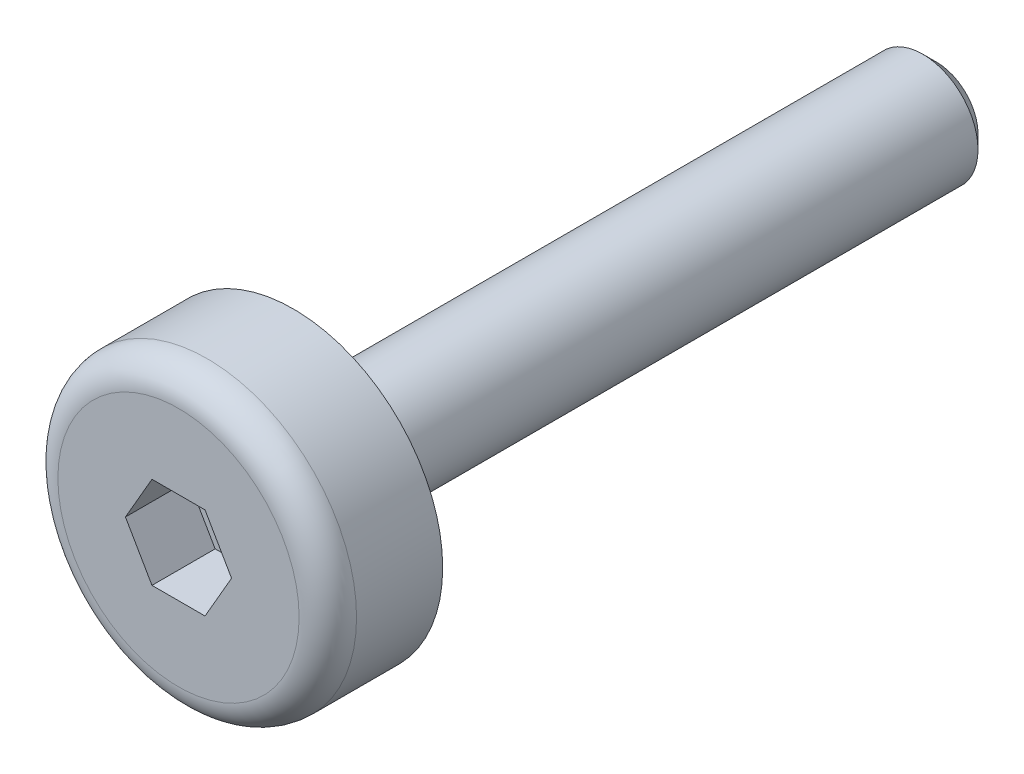
ISO-10303-21;
HEADER;
FILE_DESCRIPTION(('STEP AP214'),'2;1');
FILE_NAME('part.step','',(''),(''),'','','');
FILE_SCHEMA(('AUTOMOTIVE_DESIGN { 1 0 10303 214 1 1 1 1 }'));
ENDSEC;
DATA;
#1=APPLICATION_CONTEXT('core data for automotive mechanical design processes');
#2=APPLICATION_PROTOCOL_DEFINITION('international standard','automotive_design',2000,#1);
#3=PRODUCT_CONTEXT('',#1,'mechanical');
#4=PRODUCT('Part','Part','',(#3));
#5=PRODUCT_RELATED_PRODUCT_CATEGORY('part','',(#4));
#6=PRODUCT_DEFINITION_FORMATION('','',#4);
#7=PRODUCT_DEFINITION_CONTEXT('part definition',#1,'design');
#8=PRODUCT_DEFINITION('design','',#6,#7);
#9=PRODUCT_DEFINITION_SHAPE('','',#8);
#10=(LENGTH_UNIT() NAMED_UNIT(*) SI_UNIT(.MILLI.,.METRE.));
#11=(NAMED_UNIT(*) PLANE_ANGLE_UNIT() SI_UNIT($,.RADIAN.));
#12=(NAMED_UNIT(*) SI_UNIT($,.STERADIAN.) SOLID_ANGLE_UNIT());
#13=UNCERTAINTY_MEASURE_WITH_UNIT(LENGTH_MEASURE(1.E-05),#10,'distance_accuracy_value','');
#14=(GEOMETRIC_REPRESENTATION_CONTEXT(3) GLOBAL_UNCERTAINTY_ASSIGNED_CONTEXT((#13)) GLOBAL_UNIT_ASSIGNED_CONTEXT((#10,
#11,#12)) REPRESENTATION_CONTEXT('',''));
#15=CARTESIAN_POINT('',(0.,0.,0.));
#16=DIRECTION('',(0.,0.,1.));
#17=DIRECTION('',(1.,0.,0.));
#18=AXIS2_PLACEMENT_3D('',#15,#16,#17);
#19=CARTESIAN_POINT('',(0.,0.,-14.));
#20=DIRECTION('',(0.,0.,-1.));
#21=DIRECTION('',(-1.,0.,0.));
#22=AXIS2_PLACEMENT_3D('',#19,#20,#21);
#23=PLANE('',#22);
#24=CARTESIAN_POINT('',(0.,0.,-14.));
#25=DIRECTION('',(0.,0.,-1.));
#26=DIRECTION('',(-1.,0.,0.));
#27=AXIS2_PLACEMENT_3D('',#24,#25,#26);
#28=CIRCLE('',#27,0.899999999999988);
#29=CARTESIAN_POINT('',(-0.899999999999988,0.,-14.));
#30=VERTEX_POINT('',#29);
#31=EDGE_CURVE('E156',#30,#30,#28,.T.);
#32=ORIENTED_EDGE('',*,*,#31,.T.);
#33=EDGE_LOOP('',(#32));
#34=FACE_BOUND('',#33,.T.);
#35=ADVANCED_FACE('F40',(#34),#23,.T.);
#36=CARTESIAN_POINT('',(0.,0.,10.123));
#37=DIRECTION('',(0.,0.,1.));
#38=DIRECTION('',(1.,0.,0.));
#39=AXIS2_PLACEMENT_3D('',#36,#37,#38);
#40=CYLINDRICAL_SURFACE('',#39,1.2);
#41=CARTESIAN_POINT('',(0.,0.,-13.7));
#42=DIRECTION('',(0.,0.,-1.));
#43=DIRECTION('',(-1.,0.,0.));
#44=AXIS2_PLACEMENT_3D('',#41,#42,#43);
#45=CIRCLE('',#44,1.2);
#46=CARTESIAN_POINT('',(-1.2,0.,-13.7));
#47=VERTEX_POINT('',#46);
#48=EDGE_CURVE('E153',#47,#47,#45,.F.);
#49=ORIENTED_EDGE('',*,*,#48,.T.);
#50=EDGE_LOOP('',(#49));
#51=FACE_BOUND('',#50,.T.);
#52=CARTESIAN_POINT('',(0.,0.,0.));
#53=DIRECTION('',(0.,0.,1.));
#54=DIRECTION('',(1.,0.,0.));
#55=AXIS2_PLACEMENT_3D('',#52,#53,#54);
#56=CIRCLE('',#55,1.2);
#57=CARTESIAN_POINT('',(1.2,0.,0.));
#58=VERTEX_POINT('',#57);
#59=EDGE_CURVE('E150',#58,#58,#56,.T.);
#60=ORIENTED_EDGE('',*,*,#59,.F.);
#61=EDGE_LOOP('',(#60));
#62=FACE_BOUND('',#61,.T.);
#63=ADVANCED_FACE('F176',(#51,#62),#40,.T.);
#64=CARTESIAN_POINT('',(1.2,0.,0.));
#65=DIRECTION('',(0.,0.,-1.));
#66=DIRECTION('',(-1.,0.,0.));
#67=AXIS2_PLACEMENT_3D('',#64,#65,#66);
#68=PLANE('',#67);
#69=ORIENTED_EDGE('',*,*,#59,.T.);
#70=EDGE_LOOP('',(#69));
#71=FACE_BOUND('',#70,.T.);
#72=CARTESIAN_POINT('',(0.,0.,0.));
#73=DIRECTION('',(0.,0.,1.));
#74=DIRECTION('',(1.,0.,0.));
#75=AXIS2_PLACEMENT_3D('',#72,#73,#74);
#76=CIRCLE('',#75,3.25);
#77=CARTESIAN_POINT('',(3.25,0.,0.));
#78=VERTEX_POINT('',#77);
#79=EDGE_CURVE('E142',#78,#78,#76,.T.);
#80=ORIENTED_EDGE('',*,*,#79,.F.);
#81=EDGE_LOOP('',(#80));
#82=FACE_BOUND('',#81,.T.);
#83=ADVANCED_FACE('F182',(#71,#82),#68,.T.);
#84=CARTESIAN_POINT('',(0.,0.,10.123));
#85=DIRECTION('',(0.,0.,1.));
#86=DIRECTION('',(1.,0.,0.));
#87=AXIS2_PLACEMENT_3D('',#84,#85,#86);
#88=CYLINDRICAL_SURFACE('',#87,3.25);
#89=CARTESIAN_POINT('',(0.,0.,1.875));
#90=DIRECTION('',(0.,0.,1.));
#91=DIRECTION('',(1.,0.,0.));
#92=AXIS2_PLACEMENT_3D('',#89,#90,#91);
#93=CIRCLE('',#92,3.25);
#94=CARTESIAN_POINT('',(3.25,0.,1.875));
#95=VERTEX_POINT('',#94);
#96=EDGE_CURVE('E11',#95,#95,#93,.F.);
#97=ORIENTED_EDGE('',*,*,#96,.T.);
#98=EDGE_LOOP('',(#97));
#99=FACE_BOUND('',#98,.T.);
#100=ORIENTED_EDGE('',*,*,#79,.T.);
#101=EDGE_LOOP('',(#100));
#102=FACE_BOUND('',#101,.T.);
#103=ADVANCED_FACE('F191',(#99,#102),#88,.T.);
#104=CARTESIAN_POINT('',(3.25,0.,2.5));
#105=DIRECTION('',(0.,0.,1.));
#106=DIRECTION('',(1.,0.,0.));
#107=AXIS2_PLACEMENT_3D('',#104,#105,#106);
#108=PLANE('',#107);
#109=DIRECTION('',(0.499999999999995,0.866025403784441,0.));
#110=VECTOR('',#109,1.);
#111=CARTESIAN_POINT('',(0.577350269189637,-0.999999999999993,2.5));
#112=LINE('',#111,#110);
#113=CARTESIAN_POINT('',(0.577350269189637,-0.999999999999993,2.5));
#114=VERTEX_POINT('',#113);
#115=CARTESIAN_POINT('',(1.15470053837925,0.,2.5));
#116=VERTEX_POINT('',#115);
#117=EDGE_CURVE('E55',#114,#116,#112,.T.);
#118=ORIENTED_EDGE('',*,*,#117,.F.);
#119=DIRECTION('',(1.,0.,0.));
#120=VECTOR('',#119,1.);
#121=CARTESIAN_POINT('',(-0.577350269189617,-1.00000000000001,2.5));
#122=LINE('',#121,#120);
#123=CARTESIAN_POINT('',(-0.577350269189617,-1.00000000000001,2.5));
#124=VERTEX_POINT('',#123);
#125=EDGE_CURVE('E138',#124,#114,#122,.T.);
#126=ORIENTED_EDGE('',*,*,#125,.F.);
#127=DIRECTION('',(0.500000000000007,-0.866025403784434,0.));
#128=VECTOR('',#127,1.);
#129=CARTESIAN_POINT('',(-1.15470053837925,0.,2.5));
#130=LINE('',#129,#128);
#131=CARTESIAN_POINT('',(-1.15470053837925,0.,2.5));
#132=VERTEX_POINT('',#131);
#133=EDGE_CURVE('E136',#132,#124,#130,.T.);
#134=ORIENTED_EDGE('',*,*,#133,.F.);
#135=DIRECTION('',(-0.499999999999995,-0.866025403784442,0.));
#136=VECTOR('',#135,1.);
#137=CARTESIAN_POINT('',(-0.57735026918963,0.999999999999998,2.5));
#138=LINE('',#137,#136);
#139=CARTESIAN_POINT('',(-0.57735026918963,0.999999999999998,2.5));
#140=VERTEX_POINT('',#139);
#141=EDGE_CURVE('E103',#140,#132,#138,.T.);
#142=ORIENTED_EDGE('',*,*,#141,.F.);
#143=DIRECTION('',(-1.,0.,0.));
#144=VECTOR('',#143,1.);
#145=CARTESIAN_POINT('',(0.577350269189624,1.,2.5));
#146=LINE('',#145,#144);
#147=CARTESIAN_POINT('',(0.577350269189624,1.,2.5));
#148=VERTEX_POINT('',#147);
#149=EDGE_CURVE('E132',#148,#140,#146,.T.);
#150=ORIENTED_EDGE('',*,*,#149,.F.);
#151=DIRECTION('',(-0.500000000000001,0.866025403784438,0.));
#152=VECTOR('',#151,1.);
#153=CARTESIAN_POINT('',(1.15470053837925,0.,2.5));
#154=LINE('',#153,#152);
#155=EDGE_CURVE('E129',#116,#148,#154,.T.);
#156=ORIENTED_EDGE('',*,*,#155,.F.);
#157=EDGE_LOOP('',(#118,#126,#134,#142,#150,#156));
#158=FACE_BOUND('',#157,.T.);
#159=CARTESIAN_POINT('',(0.,0.,2.5));
#160=DIRECTION('',(0.,0.,1.));
#161=DIRECTION('',(1.,0.,0.));
#162=AXIS2_PLACEMENT_3D('',#159,#160,#161);
#163=CIRCLE('',#162,2.625);
#164=CARTESIAN_POINT('',(2.625,0.,2.5));
#165=VERTEX_POINT('',#164);
#166=EDGE_CURVE('E48',#165,#165,#163,.T.);
#167=ORIENTED_EDGE('',*,*,#166,.T.);
#168=EDGE_LOOP('',(#167));
#169=FACE_BOUND('',#168,.T.);
#170=ADVANCED_FACE('F161',(#158,#169),#108,.T.);
#171=CARTESIAN_POINT('',(0.,0.,-13.7));
#172=DIRECTION('',(0.,0.,1.));
#173=DIRECTION('',(1.,0.,0.));
#174=AXIS2_PLACEMENT_3D('',#171,#172,#173);
#175=CONICAL_SURFACE('',#174,1.2,0.785398163397451);
#176=ORIENTED_EDGE('',*,*,#31,.F.);
#177=EDGE_LOOP('',(#176));
#178=FACE_BOUND('',#177,.T.);
#179=ORIENTED_EDGE('',*,*,#48,.F.);
#180=EDGE_LOOP('',(#179));
#181=FACE_BOUND('',#180,.T.);
#182=ADVANCED_FACE('F165',(#178,#181),#175,.T.);
#183=CARTESIAN_POINT('',(0.,0.,1.875));
#184=DIRECTION('',(0.,0.,1.));
#185=DIRECTION('',(1.,0.,0.));
#186=AXIS2_PLACEMENT_3D('',#183,#184,#185);
#187=TOROIDAL_SURFACE('',#186,2.625,0.625);
#188=ORIENTED_EDGE('',*,*,#96,.F.);
#189=EDGE_LOOP('',(#188));
#190=FACE_BOUND('',#189,.T.);
#191=ORIENTED_EDGE('',*,*,#166,.F.);
#192=EDGE_LOOP('',(#191));
#193=FACE_BOUND('',#192,.T.);
#194=ADVANCED_FACE('F42',(#190,#193),#187,.T.);
#195=CARTESIAN_POINT('',(0.577350269189637,-0.999999999999993,1.125));
#196=DIRECTION('',(0.866025403784441,-0.499999999999995,0.));
#197=DIRECTION('',(0.499999999999995,0.866025403784441,0.));
#198=AXIS2_PLACEMENT_3D('',#195,#196,#197);
#199=PLANE('',#198);
#200=ORIENTED_EDGE('',*,*,#117,.T.);
#201=DIRECTION('',(0.,0.,1.));
#202=VECTOR('',#201,1.);
#203=CARTESIAN_POINT('',(1.15470053837925,0.,1.125));
#204=LINE('',#203,#202);
#205=CARTESIAN_POINT('',(1.15470053837925,0.,1.125));
#206=VERTEX_POINT('',#205);
#207=EDGE_CURVE('E85',#206,#116,#204,.T.);
#208=ORIENTED_EDGE('',*,*,#207,.F.);
#209=DIRECTION('',(0.499999999999995,0.866025403784441,0.));
#210=VECTOR('',#209,1.);
#211=CARTESIAN_POINT('',(0.577350269189637,-0.999999999999993,1.125));
#212=LINE('',#211,#210);
#213=CARTESIAN_POINT('',(0.577350269189637,-0.999999999999993,1.125));
#214=VERTEX_POINT('',#213);
#215=EDGE_CURVE('E140',#214,#206,#212,.T.);
#216=ORIENTED_EDGE('',*,*,#215,.F.);
#217=DIRECTION('',(0.,0.,1.));
#218=VECTOR('',#217,1.);
#219=CARTESIAN_POINT('',(0.577350269189637,-0.999999999999993,1.125));
#220=LINE('',#219,#218);
#221=EDGE_CURVE('E63',#214,#114,#220,.T.);
#222=ORIENTED_EDGE('',*,*,#221,.T.);
#223=EDGE_LOOP('',(#200,#208,#216,#222));
#224=FACE_BOUND('',#223,.T.);
#225=ADVANCED_FACE('F164',(#224),#199,.F.);
#226=CARTESIAN_POINT('',(-0.577350269189617,-1.00000000000001,1.125));
#227=DIRECTION('',(0.,-1.,0.));
#228=DIRECTION('',(1.,0.,0.));
#229=AXIS2_PLACEMENT_3D('',#226,#227,#228);
#230=PLANE('',#229);
#231=ORIENTED_EDGE('',*,*,#125,.T.);
#232=ORIENTED_EDGE('',*,*,#221,.F.);
#233=DIRECTION('',(1.,0.,0.));
#234=VECTOR('',#233,1.);
#235=CARTESIAN_POINT('',(-0.577350269189617,-1.00000000000001,1.125));
#236=LINE('',#235,#234);
#237=CARTESIAN_POINT('',(-0.577350269189617,-1.00000000000001,1.125));
#238=VERTEX_POINT('',#237);
#239=EDGE_CURVE('E115',#238,#214,#236,.T.);
#240=ORIENTED_EDGE('',*,*,#239,.F.);
#241=DIRECTION('',(0.,0.,1.));
#242=VECTOR('',#241,1.);
#243=CARTESIAN_POINT('',(-0.577350269189617,-1.00000000000001,1.125));
#244=LINE('',#243,#242);
#245=EDGE_CURVE('E107',#238,#124,#244,.T.);
#246=ORIENTED_EDGE('',*,*,#245,.T.);
#247=EDGE_LOOP('',(#231,#232,#240,#246));
#248=FACE_BOUND('',#247,.T.);
#249=ADVANCED_FACE('F171',(#248),#230,.F.);
#250=CARTESIAN_POINT('',(-1.15470053837925,0.,1.125));
#251=DIRECTION('',(-0.866025403784435,-0.500000000000007,0.));
#252=DIRECTION('',(0.500000000000007,-0.866025403784435,0.));
#253=AXIS2_PLACEMENT_3D('',#250,#251,#252);
#254=PLANE('',#253);
#255=ORIENTED_EDGE('',*,*,#133,.T.);
#256=ORIENTED_EDGE('',*,*,#245,.F.);
#257=DIRECTION('',(0.500000000000007,-0.866025403784434,0.));
#258=VECTOR('',#257,1.);
#259=CARTESIAN_POINT('',(-1.15470053837925,0.,1.125));
#260=LINE('',#259,#258);
#261=CARTESIAN_POINT('',(-1.15470053837925,0.,1.125));
#262=VERTEX_POINT('',#261);
#263=EDGE_CURVE('E111',#262,#238,#260,.T.);
#264=ORIENTED_EDGE('',*,*,#263,.F.);
#265=DIRECTION('',(0.,0.,1.));
#266=VECTOR('',#265,1.);
#267=CARTESIAN_POINT('',(-1.15470053837925,0.,1.125));
#268=LINE('',#267,#266);
#269=EDGE_CURVE('E96',#262,#132,#268,.T.);
#270=ORIENTED_EDGE('',*,*,#269,.T.);
#271=EDGE_LOOP('',(#255,#256,#264,#270));
#272=FACE_BOUND('',#271,.T.);
#273=ADVANCED_FACE('F112',(#272),#254,.F.);
#274=CARTESIAN_POINT('',(-0.57735026918963,0.999999999999998,1.125));
#275=DIRECTION('',(-0.866025403784442,0.499999999999995,0.));
#276=DIRECTION('',(-0.499999999999995,-0.866025403784441,0.));
#277=AXIS2_PLACEMENT_3D('',#274,#275,#276);
#278=PLANE('',#277);
#279=ORIENTED_EDGE('',*,*,#141,.T.);
#280=ORIENTED_EDGE('',*,*,#269,.F.);
#281=DIRECTION('',(-0.499999999999995,-0.866025403784442,0.));
#282=VECTOR('',#281,1.);
#283=CARTESIAN_POINT('',(-0.57735026918963,0.999999999999998,1.125));
#284=LINE('',#283,#282);
#285=CARTESIAN_POINT('',(-0.57735026918963,0.999999999999998,1.125));
#286=VERTEX_POINT('',#285);
#287=EDGE_CURVE('E100',#286,#262,#284,.T.);
#288=ORIENTED_EDGE('',*,*,#287,.F.);
#289=DIRECTION('',(0.,0.,1.));
#290=VECTOR('',#289,1.);
#291=CARTESIAN_POINT('',(-0.57735026918963,0.999999999999998,1.125));
#292=LINE('',#291,#290);
#293=EDGE_CURVE('E108',#286,#140,#292,.T.);
#294=ORIENTED_EDGE('',*,*,#293,.T.);
#295=EDGE_LOOP('',(#279,#280,#288,#294));
#296=FACE_BOUND('',#295,.T.);
#297=ADVANCED_FACE('F98',(#296),#278,.F.);
#298=CARTESIAN_POINT('',(0.577350269189624,1.,1.125));
#299=DIRECTION('',(0.,1.,0.));
#300=DIRECTION('',(-1.,0.,0.));
#301=AXIS2_PLACEMENT_3D('',#298,#299,#300);
#302=PLANE('',#301);
#303=ORIENTED_EDGE('',*,*,#149,.T.);
#304=ORIENTED_EDGE('',*,*,#293,.F.);
#305=DIRECTION('',(-1.,0.,0.));
#306=VECTOR('',#305,1.);
#307=CARTESIAN_POINT('',(0.577350269189624,1.,1.125));
#308=LINE('',#307,#306);
#309=CARTESIAN_POINT('',(0.577350269189624,1.,1.125));
#310=VERTEX_POINT('',#309);
#311=EDGE_CURVE('E121',#310,#286,#308,.T.);
#312=ORIENTED_EDGE('',*,*,#311,.F.);
#313=DIRECTION('',(0.,0.,1.));
#314=VECTOR('',#313,1.);
#315=CARTESIAN_POINT('',(0.577350269189624,1.,1.125));
#316=LINE('',#315,#314);
#317=EDGE_CURVE('E145',#310,#148,#316,.T.);
#318=ORIENTED_EDGE('',*,*,#317,.T.);
#319=EDGE_LOOP('',(#303,#304,#312,#318));
#320=FACE_BOUND('',#319,.T.);
#321=ADVANCED_FACE('F202',(#320),#302,.F.);
#322=CARTESIAN_POINT('',(1.15470053837925,0.,1.125));
#323=DIRECTION('',(0.866025403784438,0.500000000000001,0.));
#324=DIRECTION('',(-0.500000000000001,0.866025403784438,0.));
#325=AXIS2_PLACEMENT_3D('',#322,#323,#324);
#326=PLANE('',#325);
#327=ORIENTED_EDGE('',*,*,#155,.T.);
#328=ORIENTED_EDGE('',*,*,#317,.F.);
#329=DIRECTION('',(-0.500000000000001,0.866025403784438,0.));
#330=VECTOR('',#329,1.);
#331=CARTESIAN_POINT('',(1.15470053837925,0.,1.125));
#332=LINE('',#331,#330);
#333=EDGE_CURVE('E123',#206,#310,#332,.T.);
#334=ORIENTED_EDGE('',*,*,#333,.F.);
#335=ORIENTED_EDGE('',*,*,#207,.T.);
#336=EDGE_LOOP('',(#327,#328,#334,#335));
#337=FACE_BOUND('',#336,.T.);
#338=ADVANCED_FACE('F199',(#337),#326,.F.);
#339=CARTESIAN_POINT('',(0.,0.,1.125));
#340=DIRECTION('',(0.,0.,1.));
#341=DIRECTION('',(1.,0.,0.));
#342=AXIS2_PLACEMENT_3D('',#339,#340,#341);
#343=PLANE('',#342);
#344=ORIENTED_EDGE('',*,*,#215,.T.);
#345=ORIENTED_EDGE('',*,*,#333,.T.);
#346=ORIENTED_EDGE('',*,*,#311,.T.);
#347=ORIENTED_EDGE('',*,*,#287,.T.);
#348=ORIENTED_EDGE('',*,*,#263,.T.);
#349=ORIENTED_EDGE('',*,*,#239,.T.);
#350=EDGE_LOOP('',(#344,#345,#346,#347,#348,#349));
#351=FACE_BOUND('',#350,.T.);
#352=ADVANCED_FACE('F118',(#351),#343,.T.);
#353=CLOSED_SHELL('',(#35,#63,#83,#103,#170,#182,#194,#225,#249,#273,#297,#321,#338,#352));
#354=MANIFOLD_SOLID_BREP('B2',#353);
#355=ADVANCED_BREP_SHAPE_REPRESENTATION('',(#18,#354),#14);
#356=SHAPE_DEFINITION_REPRESENTATION(#9,#355);
ENDSEC;
END-ISO-10303-21;
